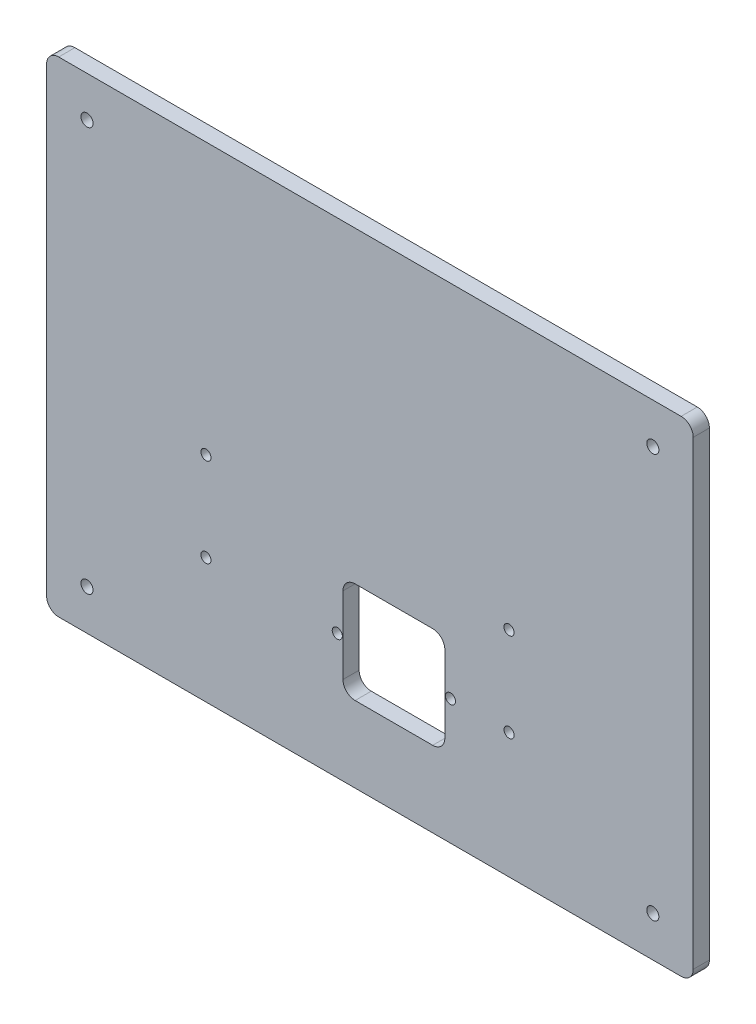
ISO-10303-21;
HEADER;
FILE_DESCRIPTION(('STEP AP214'),'2;1');
FILE_NAME('part.step','',(''),(''),'','','');
FILE_SCHEMA(('AUTOMOTIVE_DESIGN { 1 0 10303 214 1 1 1 1 }'));
ENDSEC;
DATA;
#1=APPLICATION_CONTEXT('core data for automotive mechanical design processes');
#2=APPLICATION_PROTOCOL_DEFINITION('international standard','automotive_design',2000,#1);
#3=PRODUCT_CONTEXT('',#1,'mechanical');
#4=PRODUCT('Part','Part','',(#3));
#5=PRODUCT_RELATED_PRODUCT_CATEGORY('part','',(#4));
#6=PRODUCT_DEFINITION_FORMATION('','',#4);
#7=PRODUCT_DEFINITION_CONTEXT('part definition',#1,'design');
#8=PRODUCT_DEFINITION('design','',#6,#7);
#9=PRODUCT_DEFINITION_SHAPE('','',#8);
#10=(LENGTH_UNIT() NAMED_UNIT(*) SI_UNIT(.MILLI.,.METRE.));
#11=(NAMED_UNIT(*) PLANE_ANGLE_UNIT() SI_UNIT($,.RADIAN.));
#12=(NAMED_UNIT(*) SI_UNIT($,.STERADIAN.) SOLID_ANGLE_UNIT());
#13=UNCERTAINTY_MEASURE_WITH_UNIT(LENGTH_MEASURE(1.E-05),#10,'distance_accuracy_value','');
#14=(GEOMETRIC_REPRESENTATION_CONTEXT(3) GLOBAL_UNCERTAINTY_ASSIGNED_CONTEXT((#13)) GLOBAL_UNIT_ASSIGNED_CONTEXT((#10,
#11,#12)) REPRESENTATION_CONTEXT('',''));
#15=CARTESIAN_POINT('',(0.,0.,0.));
#16=DIRECTION('',(0.,0.,1.));
#17=DIRECTION('',(1.,0.,0.));
#18=AXIS2_PLACEMENT_3D('',#15,#16,#17);
#19=CARTESIAN_POINT('',(-47.5,-60.,4.));
#20=DIRECTION('',(0.,1.,0.));
#21=DIRECTION('',(0.,0.,1.));
#22=AXIS2_PLACEMENT_3D('',#19,#20,#21);
#23=PLANE('',#22);
#24=DIRECTION('',(1.,0.,0.));
#25=VECTOR('',#24,1.);
#26=CARTESIAN_POINT('',(-47.5,-60.,0.));
#27=LINE('',#26,#25);
#28=CARTESIAN_POINT('',(-77.5,-60.,0.));
#29=VERTEX_POINT('',#28);
#30=CARTESIAN_POINT('',(76.5,-60.,0.));
#31=VERTEX_POINT('',#30);
#32=EDGE_CURVE('E240',#29,#31,#27,.T.);
#33=ORIENTED_EDGE('',*,*,#32,.T.);
#34=DIRECTION('',(0.,0.,1.));
#35=VECTOR('',#34,1.);
#36=CARTESIAN_POINT('',(76.5,-60.,4.));
#37=LINE('',#36,#35);
#38=CARTESIAN_POINT('',(76.5,-60.,4.));
#39=VERTEX_POINT('',#38);
#40=EDGE_CURVE('E166',#31,#39,#37,.T.);
#41=ORIENTED_EDGE('',*,*,#40,.T.);
#42=DIRECTION('',(1.,0.,0.));
#43=VECTOR('',#42,1.);
#44=CARTESIAN_POINT('',(-47.5,-60.,4.));
#45=LINE('',#44,#43);
#46=CARTESIAN_POINT('',(-77.5,-60.,4.));
#47=VERTEX_POINT('',#46);
#48=EDGE_CURVE('E246',#47,#39,#45,.T.);
#49=ORIENTED_EDGE('',*,*,#48,.F.);
#50=DIRECTION('',(0.,0.,1.));
#51=VECTOR('',#50,1.);
#52=CARTESIAN_POINT('',(-77.5,-60.,0.));
#53=LINE('',#52,#51);
#54=EDGE_CURVE('E64',#47,#29,#53,.F.);
#55=ORIENTED_EDGE('',*,*,#54,.T.);
#56=EDGE_LOOP('',(#33,#41,#49,#55));
#57=FACE_BOUND('',#56,.T.);
#58=ADVANCED_FACE('F43',(#57),#23,.F.);
#59=CARTESIAN_POINT('',(-47.5,60.,4.));
#60=DIRECTION('',(0.,1.,0.));
#61=DIRECTION('',(0.,0.,1.));
#62=AXIS2_PLACEMENT_3D('',#59,#60,#61);
#63=PLANE('',#62);
#64=DIRECTION('',(1.,0.,0.));
#65=VECTOR('',#64,1.);
#66=CARTESIAN_POINT('',(-47.5,60.,0.));
#67=LINE('',#66,#65);
#68=CARTESIAN_POINT('',(-77.5,60.,0.));
#69=VERTEX_POINT('',#68);
#70=CARTESIAN_POINT('',(76.5,60.,0.));
#71=VERTEX_POINT('',#70);
#72=EDGE_CURVE('E249',#69,#71,#67,.T.);
#73=ORIENTED_EDGE('',*,*,#72,.F.);
#74=DIRECTION('',(0.,0.,1.));
#75=VECTOR('',#74,1.);
#76=CARTESIAN_POINT('',(-77.5,60.,4.));
#77=LINE('',#76,#75);
#78=CARTESIAN_POINT('',(-77.5,60.,4.));
#79=VERTEX_POINT('',#78);
#80=EDGE_CURVE('E275',#69,#79,#77,.T.);
#81=ORIENTED_EDGE('',*,*,#80,.T.);
#82=DIRECTION('',(1.,0.,0.));
#83=VECTOR('',#82,1.);
#84=CARTESIAN_POINT('',(-47.5,60.,4.));
#85=LINE('',#84,#83);
#86=CARTESIAN_POINT('',(76.5,60.,4.));
#87=VERTEX_POINT('',#86);
#88=EDGE_CURVE('E248',#79,#87,#85,.T.);
#89=ORIENTED_EDGE('',*,*,#88,.T.);
#90=DIRECTION('',(0.,0.,1.));
#91=VECTOR('',#90,1.);
#92=CARTESIAN_POINT('',(76.5,60.,4.));
#93=LINE('',#92,#91);
#94=EDGE_CURVE('E269',#87,#71,#93,.F.);
#95=ORIENTED_EDGE('',*,*,#94,.T.);
#96=EDGE_LOOP('',(#73,#81,#89,#95));
#97=FACE_BOUND('',#96,.T.);
#98=ADVANCED_FACE('F358',(#97),#63,.T.);
#99=CARTESIAN_POINT('',(0.,0.,4.));
#100=DIRECTION('',(0.,0.,-1.));
#101=DIRECTION('',(-1.,0.,0.));
#102=AXIS2_PLACEMENT_3D('',#99,#100,#101);
#103=PLANE('',#102);
#104=CARTESIAN_POINT('',(69.5000000000135,-50.0000000000072,4.));
#105=DIRECTION('',(0.,0.,-1.));
#106=DIRECTION('',(-1.,0.,0.));
#107=AXIS2_PLACEMENT_3D('',#104,#105,#106);
#108=CIRCLE('',#107,1.50000000000001);
#109=CARTESIAN_POINT('',(68.0000000000134,-50.0000000000072,4.));
#110=VERTEX_POINT('',#109);
#111=EDGE_CURVE('E446',#110,#110,#108,.T.);
#112=ORIENTED_EDGE('',*,*,#111,.T.);
#113=EDGE_LOOP('',(#112));
#114=FACE_BOUND('',#113,.T.);
#115=CARTESIAN_POINT('',(69.5000000000127,49.9999999999928,4.));
#116=DIRECTION('',(0.,0.,-1.));
#117=DIRECTION('',(-1.,0.,0.));
#118=AXIS2_PLACEMENT_3D('',#115,#116,#117);
#119=CIRCLE('',#118,1.5);
#120=CARTESIAN_POINT('',(68.0000000000127,49.9999999999928,4.));
#121=VERTEX_POINT('',#120);
#122=EDGE_CURVE('E442',#121,#121,#119,.T.);
#123=ORIENTED_EDGE('',*,*,#122,.T.);
#124=EDGE_LOOP('',(#123));
#125=FACE_BOUND('',#124,.T.);
#126=CARTESIAN_POINT('',(-70.4999999999906,49.9999999999917,4.));
#127=DIRECTION('',(0.,0.,-1.));
#128=DIRECTION('',(-1.,0.,0.));
#129=AXIS2_PLACEMENT_3D('',#126,#127,#128);
#130=CIRCLE('',#129,1.5);
#131=CARTESIAN_POINT('',(-71.9999999999906,49.9999999999917,4.));
#132=VERTEX_POINT('',#131);
#133=EDGE_CURVE('E427',#132,#132,#130,.T.);
#134=ORIENTED_EDGE('',*,*,#133,.T.);
#135=EDGE_LOOP('',(#134));
#136=FACE_BOUND('',#135,.T.);
#137=CARTESIAN_POINT('',(-70.4999999999899,-50.0000000000083,4.));
#138=DIRECTION('',(0.,0.,-1.));
#139=DIRECTION('',(-1.,0.,0.));
#140=AXIS2_PLACEMENT_3D('',#137,#138,#139);
#141=CIRCLE('',#140,1.5);
#142=CARTESIAN_POINT('',(-71.9999999999899,-50.0000000000083,4.));
#143=VERTEX_POINT('',#142);
#144=EDGE_CURVE('E316',#143,#143,#141,.T.);
#145=ORIENTED_EDGE('',*,*,#144,.T.);
#146=EDGE_LOOP('',(#145));
#147=FACE_BOUND('',#146,.T.);
#148=DIRECTION('',(0.,-1.,0.));
#149=VECTOR('',#148,1.);
#150=CARTESIAN_POINT('',(18.0333475917252,-16.2240951432028,4.));
#151=LINE('',#150,#149);
#152=CARTESIAN_POINT('',(18.0333475917252,-19.2240951432028,4.));
#153=VERTEX_POINT('',#152);
#154=CARTESIAN_POINT('',(18.0333475917251,-38.2240951432028,4.));
#155=VERTEX_POINT('',#154);
#156=EDGE_CURVE('E180',#153,#155,#151,.T.);
#157=ORIENTED_EDGE('',*,*,#156,.T.);
#158=CARTESIAN_POINT('',(15.0333475917251,-38.2240951432028,4.));
#159=DIRECTION('',(0.,0.,-1.));
#160=DIRECTION('',(-1.,0.,0.));
#161=AXIS2_PLACEMENT_3D('',#158,#159,#160);
#162=CIRCLE('',#161,3.);
#163=CARTESIAN_POINT('',(15.0333475917251,-41.2240951432028,4.));
#164=VERTEX_POINT('',#163);
#165=EDGE_CURVE('E304',#155,#164,#162,.T.);
#166=ORIENTED_EDGE('',*,*,#165,.T.);
#167=DIRECTION('',(-1.,0.,0.));
#168=VECTOR('',#167,1.);
#169=CARTESIAN_POINT('',(-7.16665240827485,-41.2240951432028,4.));
#170=LINE('',#169,#168);
#171=CARTESIAN_POINT('',(-4.16665240827485,-41.2240951432028,4.));
#172=VERTEX_POINT('',#171);
#173=EDGE_CURVE('E203',#164,#172,#170,.T.);
#174=ORIENTED_EDGE('',*,*,#173,.T.);
#175=CARTESIAN_POINT('',(-4.16665240827485,-38.2240951432028,4.));
#176=DIRECTION('',(0.,0.,-1.));
#177=DIRECTION('',(-1.,0.,0.));
#178=AXIS2_PLACEMENT_3D('',#175,#176,#177);
#179=CIRCLE('',#178,3.);
#180=CARTESIAN_POINT('',(-7.16665240827485,-38.2240951432028,4.));
#181=VERTEX_POINT('',#180);
#182=EDGE_CURVE('E307',#172,#181,#179,.T.);
#183=ORIENTED_EDGE('',*,*,#182,.T.);
#184=DIRECTION('',(0.,1.,0.));
#185=VECTOR('',#184,1.);
#186=CARTESIAN_POINT('',(-7.16665240827485,-16.2240951432028,4.));
#187=LINE('',#186,#185);
#188=CARTESIAN_POINT('',(-7.16665240827485,-19.2240951432028,4.));
#189=VERTEX_POINT('',#188);
#190=EDGE_CURVE('E188',#181,#189,#187,.T.);
#191=ORIENTED_EDGE('',*,*,#190,.T.);
#192=CARTESIAN_POINT('',(-4.16665240827485,-19.2240951432028,4.));
#193=DIRECTION('',(0.,0.,-1.));
#194=DIRECTION('',(-1.,0.,0.));
#195=AXIS2_PLACEMENT_3D('',#192,#193,#194);
#196=CIRCLE('',#195,3.);
#197=CARTESIAN_POINT('',(-4.16665240827485,-16.2240951432028,4.));
#198=VERTEX_POINT('',#197);
#199=EDGE_CURVE('E11',#189,#198,#196,.T.);
#200=ORIENTED_EDGE('',*,*,#199,.T.);
#201=DIRECTION('',(1.,0.,0.));
#202=VECTOR('',#201,1.);
#203=CARTESIAN_POINT('',(-7.16665240827485,-16.2240951432028,4.));
#204=LINE('',#203,#202);
#205=CARTESIAN_POINT('',(15.0333475917252,-16.2240951432028,4.));
#206=VERTEX_POINT('',#205);
#207=EDGE_CURVE('E327',#198,#206,#204,.T.);
#208=ORIENTED_EDGE('',*,*,#207,.T.);
#209=CARTESIAN_POINT('',(15.0333475917252,-19.2240951432028,4.));
#210=DIRECTION('',(0.,0.,-1.));
#211=DIRECTION('',(-1.,0.,0.));
#212=AXIS2_PLACEMENT_3D('',#209,#210,#211);
#213=CIRCLE('',#212,3.);
#214=EDGE_CURVE('E170',#206,#153,#213,.T.);
#215=ORIENTED_EDGE('',*,*,#214,.T.);
#216=EDGE_LOOP('',(#157,#166,#174,#183,#191,#200,#208,#215));
#217=FACE_BOUND('',#216,.T.);
#218=CARTESIAN_POINT('',(33.9254697723463,-29.0234263182221,4.));
#219=DIRECTION('',(0.,0.,1.));
#220=DIRECTION('',(1.,0.,0.));
#221=AXIS2_PLACEMENT_3D('',#218,#219,#220);
#222=CIRCLE('',#221,1.25);
#223=CARTESIAN_POINT('',(35.1754697723463,-29.0234263182221,4.));
#224=VERTEX_POINT('',#223);
#225=EDGE_CURVE('E211',#224,#224,#222,.T.);
#226=ORIENTED_EDGE('',*,*,#225,.F.);
#227=EDGE_LOOP('',(#226));
#228=FACE_BOUND('',#227,.T.);
#229=CARTESIAN_POINT('',(-41.0745302242441,-29.0234263182226,4.));
#230=DIRECTION('',(0.,0.,1.));
#231=DIRECTION('',(1.,0.,0.));
#232=AXIS2_PLACEMENT_3D('',#229,#230,#231);
#233=CIRCLE('',#232,1.25);
#234=CARTESIAN_POINT('',(-39.8245302242441,-29.0234263182226,4.));
#235=VERTEX_POINT('',#234);
#236=EDGE_CURVE('E202',#235,#235,#233,.T.);
#237=ORIENTED_EDGE('',*,*,#236,.F.);
#238=EDGE_LOOP('',(#237));
#239=FACE_BOUND('',#238,.T.);
#240=CARTESIAN_POINT('',(-41.0745302242442,-7.02342649884435,4.));
#241=DIRECTION('',(0.,0.,1.));
#242=DIRECTION('',(1.,0.,0.));
#243=AXIS2_PLACEMENT_3D('',#240,#241,#242);
#244=CIRCLE('',#243,1.25);
#245=CARTESIAN_POINT('',(-39.8245302242442,-7.02342649884435,4.));
#246=VERTEX_POINT('',#245);
#247=EDGE_CURVE('E223',#246,#246,#244,.T.);
#248=ORIENTED_EDGE('',*,*,#247,.F.);
#249=EDGE_LOOP('',(#248));
#250=FACE_BOUND('',#249,.T.);
#251=CARTESIAN_POINT('',(-8.5745336312968,-29.0234263182224,4.));
#252=DIRECTION('',(0.,0.,1.));
#253=DIRECTION('',(1.,0.,0.));
#254=AXIS2_PLACEMENT_3D('',#251,#252,#253);
#255=CIRCLE('',#254,1.25083438924972);
#256=CARTESIAN_POINT('',(-7.32369924204708,-29.0234263182224,4.));
#257=VERTEX_POINT('',#256);
#258=EDGE_CURVE('E216',#257,#257,#255,.T.);
#259=ORIENTED_EDGE('',*,*,#258,.F.);
#260=EDGE_LOOP('',(#259));
#261=FACE_BOUND('',#260,.T.);
#262=CARTESIAN_POINT('',(33.9254697723315,-7.02342649884379,4.));
#263=DIRECTION('',(0.,0.,1.));
#264=DIRECTION('',(1.,0.,0.));
#265=AXIS2_PLACEMENT_3D('',#262,#263,#264);
#266=CIRCLE('',#265,1.24999999999896);
#267=CARTESIAN_POINT('',(35.1754697723305,-7.02342649884379,4.));
#268=VERTEX_POINT('',#267);
#269=EDGE_CURVE('E196',#268,#268,#266,.T.);
#270=ORIENTED_EDGE('',*,*,#269,.F.);
#271=EDGE_LOOP('',(#270));
#272=FACE_BOUND('',#271,.T.);
#273=CARTESIAN_POINT('',(19.4254663687032,-29.0234263182222,4.));
#274=DIRECTION('',(0.,0.,1.));
#275=DIRECTION('',(1.,0.,0.));
#276=AXIS2_PLACEMENT_3D('',#273,#274,#275);
#277=CIRCLE('',#276,1.25);
#278=CARTESIAN_POINT('',(20.6754663687032,-29.0234263182222,4.));
#279=VERTEX_POINT('',#278);
#280=EDGE_CURVE('E218',#279,#279,#277,.T.);
#281=ORIENTED_EDGE('',*,*,#280,.F.);
#282=EDGE_LOOP('',(#281));
#283=FACE_BOUND('',#282,.T.);
#284=ORIENTED_EDGE('',*,*,#88,.F.);
#285=CARTESIAN_POINT('',(-77.5,57.,4.));
#286=DIRECTION('',(0.,0.,-1.));
#287=DIRECTION('',(-1.,0.,0.));
#288=AXIS2_PLACEMENT_3D('',#285,#286,#287);
#289=CIRCLE('',#288,3.);
#290=CARTESIAN_POINT('',(-80.5,57.,4.));
#291=VERTEX_POINT('',#290);
#292=EDGE_CURVE('E281',#79,#291,#289,.F.);
#293=ORIENTED_EDGE('',*,*,#292,.T.);
#294=DIRECTION('',(0.,-1.,0.));
#295=VECTOR('',#294,1.);
#296=CARTESIAN_POINT('',(-80.5,60.,4.));
#297=LINE('',#296,#295);
#298=CARTESIAN_POINT('',(-80.5,-57.,4.));
#299=VERTEX_POINT('',#298);
#300=EDGE_CURVE('E238',#291,#299,#297,.T.);
#301=ORIENTED_EDGE('',*,*,#300,.T.);
#302=CARTESIAN_POINT('',(-77.5,-57.,4.));
#303=DIRECTION('',(0.,0.,-1.));
#304=DIRECTION('',(-1.,0.,0.));
#305=AXIS2_PLACEMENT_3D('',#302,#303,#304);
#306=CIRCLE('',#305,3.);
#307=EDGE_CURVE('E273',#299,#47,#306,.F.);
#308=ORIENTED_EDGE('',*,*,#307,.T.);
#309=ORIENTED_EDGE('',*,*,#48,.T.);
#310=CARTESIAN_POINT('',(76.5,-57.,4.));
#311=DIRECTION('',(0.,0.,-1.));
#312=DIRECTION('',(-1.,0.,0.));
#313=AXIS2_PLACEMENT_3D('',#310,#311,#312);
#314=CIRCLE('',#313,3.);
#315=CARTESIAN_POINT('',(79.5,-57.,4.));
#316=VERTEX_POINT('',#315);
#317=EDGE_CURVE('E280',#39,#316,#314,.F.);
#318=ORIENTED_EDGE('',*,*,#317,.T.);
#319=DIRECTION('',(0.,1.,0.));
#320=VECTOR('',#319,1.);
#321=CARTESIAN_POINT('',(79.5,60.,4.));
#322=LINE('',#321,#320);
#323=CARTESIAN_POINT('',(79.5,57.,4.));
#324=VERTEX_POINT('',#323);
#325=EDGE_CURVE('E234',#316,#324,#322,.T.);
#326=ORIENTED_EDGE('',*,*,#325,.T.);
#327=CARTESIAN_POINT('',(76.5,57.,4.));
#328=DIRECTION('',(0.,0.,-1.));
#329=DIRECTION('',(-1.,0.,0.));
#330=AXIS2_PLACEMENT_3D('',#327,#328,#329);
#331=CIRCLE('',#330,3.);
#332=EDGE_CURVE('E278',#324,#87,#331,.F.);
#333=ORIENTED_EDGE('',*,*,#332,.T.);
#334=EDGE_LOOP('',(#284,#293,#301,#308,#309,#318,#326,#333));
#335=FACE_BOUND('',#334,.T.);
#336=ADVANCED_FACE('F324',(#114,#125,#136,#147,#217,#228,#239,#250,#261,#272,#283,#335),#103,.F.);
#337=CARTESIAN_POINT('',(0.,0.,0.));
#338=DIRECTION('',(0.,0.,-1.));
#339=DIRECTION('',(-1.,0.,0.));
#340=AXIS2_PLACEMENT_3D('',#337,#338,#339);
#341=PLANE('',#340);
#342=CARTESIAN_POINT('',(69.5000000000135,-50.0000000000072,0.));
#343=DIRECTION('',(0.,0.,-1.));
#344=DIRECTION('',(-1.,0.,0.));
#345=AXIS2_PLACEMENT_3D('',#342,#343,#344);
#346=CIRCLE('',#345,1.50000000000001);
#347=CARTESIAN_POINT('',(68.0000000000134,-50.0000000000072,0.));
#348=VERTEX_POINT('',#347);
#349=EDGE_CURVE('E447',#348,#348,#346,.T.);
#350=ORIENTED_EDGE('',*,*,#349,.F.);
#351=EDGE_LOOP('',(#350));
#352=FACE_BOUND('',#351,.T.);
#353=CARTESIAN_POINT('',(69.5000000000127,49.9999999999928,0.));
#354=DIRECTION('',(0.,0.,-1.));
#355=DIRECTION('',(-1.,0.,0.));
#356=AXIS2_PLACEMENT_3D('',#353,#354,#355);
#357=CIRCLE('',#356,1.5);
#358=CARTESIAN_POINT('',(68.0000000000127,49.9999999999928,0.));
#359=VERTEX_POINT('',#358);
#360=EDGE_CURVE('E438',#359,#359,#357,.T.);
#361=ORIENTED_EDGE('',*,*,#360,.F.);
#362=EDGE_LOOP('',(#361));
#363=FACE_BOUND('',#362,.T.);
#364=CARTESIAN_POINT('',(-70.4999999999906,49.9999999999917,0.));
#365=DIRECTION('',(0.,0.,-1.));
#366=DIRECTION('',(-1.,0.,0.));
#367=AXIS2_PLACEMENT_3D('',#364,#365,#366);
#368=CIRCLE('',#367,1.5);
#369=CARTESIAN_POINT('',(-71.9999999999906,49.9999999999917,0.));
#370=VERTEX_POINT('',#369);
#371=EDGE_CURVE('E433',#370,#370,#368,.T.);
#372=ORIENTED_EDGE('',*,*,#371,.F.);
#373=EDGE_LOOP('',(#372));
#374=FACE_BOUND('',#373,.T.);
#375=CARTESIAN_POINT('',(-70.4999999999899,-50.0000000000083,0.));
#376=DIRECTION('',(0.,0.,-1.));
#377=DIRECTION('',(-1.,0.,0.));
#378=AXIS2_PLACEMENT_3D('',#375,#376,#377);
#379=CIRCLE('',#378,1.5);
#380=CARTESIAN_POINT('',(-71.9999999999899,-50.0000000000083,0.));
#381=VERTEX_POINT('',#380);
#382=EDGE_CURVE('E434',#381,#381,#379,.T.);
#383=ORIENTED_EDGE('',*,*,#382,.F.);
#384=EDGE_LOOP('',(#383));
#385=FACE_BOUND('',#384,.T.);
#386=DIRECTION('',(0.,1.,0.));
#387=VECTOR('',#386,1.);
#388=CARTESIAN_POINT('',(-7.16665240827485,-16.2240951432028,0.));
#389=LINE('',#388,#387);
#390=CARTESIAN_POINT('',(-7.16665240827485,-38.2240951432028,0.));
#391=VERTEX_POINT('',#390);
#392=CARTESIAN_POINT('',(-7.16665240827485,-19.2240951432028,0.));
#393=VERTEX_POINT('',#392);
#394=EDGE_CURVE('E195',#391,#393,#389,.T.);
#395=ORIENTED_EDGE('',*,*,#394,.F.);
#396=CARTESIAN_POINT('',(-4.16665240827485,-38.2240951432028,0.));
#397=DIRECTION('',(0.,0.,-1.));
#398=DIRECTION('',(-1.,0.,0.));
#399=AXIS2_PLACEMENT_3D('',#396,#397,#398);
#400=CIRCLE('',#399,3.);
#401=CARTESIAN_POINT('',(-4.16665240827485,-41.2240951432028,0.));
#402=VERTEX_POINT('',#401);
#403=EDGE_CURVE('E310',#391,#402,#400,.F.);
#404=ORIENTED_EDGE('',*,*,#403,.T.);
#405=DIRECTION('',(-1.,0.,0.));
#406=VECTOR('',#405,1.);
#407=CARTESIAN_POINT('',(-7.16665240827485,-41.2240951432028,0.));
#408=LINE('',#407,#406);
#409=CARTESIAN_POINT('',(15.0333475917251,-41.2240951432028,0.));
#410=VERTEX_POINT('',#409);
#411=EDGE_CURVE('E187',#410,#402,#408,.T.);
#412=ORIENTED_EDGE('',*,*,#411,.F.);
#413=CARTESIAN_POINT('',(15.0333475917251,-38.2240951432028,0.));
#414=DIRECTION('',(0.,0.,-1.));
#415=DIRECTION('',(-1.,0.,0.));
#416=AXIS2_PLACEMENT_3D('',#413,#414,#415);
#417=CIRCLE('',#416,3.);
#418=CARTESIAN_POINT('',(18.0333475917251,-38.2240951432028,0.));
#419=VERTEX_POINT('',#418);
#420=EDGE_CURVE('E184',#410,#419,#417,.F.);
#421=ORIENTED_EDGE('',*,*,#420,.T.);
#422=DIRECTION('',(0.,-1.,0.));
#423=VECTOR('',#422,1.);
#424=CARTESIAN_POINT('',(18.0333475917252,-16.2240951432028,0.));
#425=LINE('',#424,#423);
#426=CARTESIAN_POINT('',(18.0333475917252,-19.2240951432028,0.));
#427=VERTEX_POINT('',#426);
#428=EDGE_CURVE('E172',#427,#419,#425,.T.);
#429=ORIENTED_EDGE('',*,*,#428,.F.);
#430=CARTESIAN_POINT('',(15.0333475917252,-19.2240951432028,0.));
#431=DIRECTION('',(0.,0.,-1.));
#432=DIRECTION('',(-1.,0.,0.));
#433=AXIS2_PLACEMENT_3D('',#430,#431,#432);
#434=CIRCLE('',#433,3.);
#435=CARTESIAN_POINT('',(15.0333475917252,-16.2240951432028,0.));
#436=VERTEX_POINT('',#435);
#437=EDGE_CURVE('E160',#427,#436,#434,.F.);
#438=ORIENTED_EDGE('',*,*,#437,.T.);
#439=DIRECTION('',(1.,0.,0.));
#440=VECTOR('',#439,1.);
#441=CARTESIAN_POINT('',(-7.16665240827485,-16.2240951432028,0.));
#442=LINE('',#441,#440);
#443=CARTESIAN_POINT('',(-4.16665240827485,-16.2240951432028,0.));
#444=VERTEX_POINT('',#443);
#445=EDGE_CURVE('E190',#444,#436,#442,.T.);
#446=ORIENTED_EDGE('',*,*,#445,.F.);
#447=CARTESIAN_POINT('',(-4.16665240827485,-19.2240951432028,0.));
#448=DIRECTION('',(0.,0.,-1.));
#449=DIRECTION('',(-1.,0.,0.));
#450=AXIS2_PLACEMENT_3D('',#447,#448,#449);
#451=CIRCLE('',#450,3.);
#452=EDGE_CURVE('E51',#444,#393,#451,.F.);
#453=ORIENTED_EDGE('',*,*,#452,.T.);
#454=EDGE_LOOP('',(#395,#404,#412,#421,#429,#438,#446,#453));
#455=FACE_BOUND('',#454,.T.);
#456=CARTESIAN_POINT('',(33.9254697723463,-29.0234263182221,0.));
#457=DIRECTION('',(0.,0.,1.));
#458=DIRECTION('',(1.,0.,0.));
#459=AXIS2_PLACEMENT_3D('',#456,#457,#458);
#460=CIRCLE('',#459,1.25);
#461=CARTESIAN_POINT('',(35.1754697723463,-29.0234263182221,0.));
#462=VERTEX_POINT('',#461);
#463=EDGE_CURVE('E198',#462,#462,#460,.T.);
#464=ORIENTED_EDGE('',*,*,#463,.T.);
#465=EDGE_LOOP('',(#464));
#466=FACE_BOUND('',#465,.T.);
#467=CARTESIAN_POINT('',(-41.0745302242441,-29.0234263182226,0.));
#468=DIRECTION('',(0.,0.,1.));
#469=DIRECTION('',(1.,0.,0.));
#470=AXIS2_PLACEMENT_3D('',#467,#468,#469);
#471=CIRCLE('',#470,1.25);
#472=CARTESIAN_POINT('',(-39.8245302242441,-29.0234263182226,0.));
#473=VERTEX_POINT('',#472);
#474=EDGE_CURVE('E206',#473,#473,#471,.T.);
#475=ORIENTED_EDGE('',*,*,#474,.T.);
#476=EDGE_LOOP('',(#475));
#477=FACE_BOUND('',#476,.T.);
#478=CARTESIAN_POINT('',(-41.0745302242442,-7.02342649884435,0.));
#479=DIRECTION('',(0.,0.,1.));
#480=DIRECTION('',(1.,0.,0.));
#481=AXIS2_PLACEMENT_3D('',#478,#479,#480);
#482=CIRCLE('',#481,1.25);
#483=CARTESIAN_POINT('',(-39.8245302242442,-7.02342649884435,0.));
#484=VERTEX_POINT('',#483);
#485=EDGE_CURVE('E210',#484,#484,#482,.T.);
#486=ORIENTED_EDGE('',*,*,#485,.T.);
#487=EDGE_LOOP('',(#486));
#488=FACE_BOUND('',#487,.T.);
#489=CARTESIAN_POINT('',(-8.5745336312968,-29.0234263182224,0.));
#490=DIRECTION('',(0.,0.,1.));
#491=DIRECTION('',(1.,0.,0.));
#492=AXIS2_PLACEMENT_3D('',#489,#490,#491);
#493=CIRCLE('',#492,1.25083438924972);
#494=CARTESIAN_POINT('',(-7.32369924204708,-29.0234263182224,0.));
#495=VERTEX_POINT('',#494);
#496=EDGE_CURVE('E220',#495,#495,#493,.T.);
#497=ORIENTED_EDGE('',*,*,#496,.T.);
#498=EDGE_LOOP('',(#497));
#499=FACE_BOUND('',#498,.T.);
#500=CARTESIAN_POINT('',(33.9254697723315,-7.02342649884379,0.));
#501=DIRECTION('',(0.,0.,1.));
#502=DIRECTION('',(1.,0.,0.));
#503=AXIS2_PLACEMENT_3D('',#500,#501,#502);
#504=CIRCLE('',#503,1.24999999999896);
#505=CARTESIAN_POINT('',(35.1754697723305,-7.02342649884379,0.));
#506=VERTEX_POINT('',#505);
#507=EDGE_CURVE('E200',#506,#506,#504,.T.);
#508=ORIENTED_EDGE('',*,*,#507,.T.);
#509=EDGE_LOOP('',(#508));
#510=FACE_BOUND('',#509,.T.);
#511=CARTESIAN_POINT('',(19.4254663687032,-29.0234263182222,0.));
#512=DIRECTION('',(0.,0.,1.));
#513=DIRECTION('',(1.,0.,0.));
#514=AXIS2_PLACEMENT_3D('',#511,#512,#513);
#515=CIRCLE('',#514,1.25);
#516=CARTESIAN_POINT('',(20.6754663687032,-29.0234263182222,0.));
#517=VERTEX_POINT('',#516);
#518=EDGE_CURVE('E226',#517,#517,#515,.T.);
#519=ORIENTED_EDGE('',*,*,#518,.T.);
#520=EDGE_LOOP('',(#519));
#521=FACE_BOUND('',#520,.T.);
#522=DIRECTION('',(0.,-1.,0.));
#523=VECTOR('',#522,1.);
#524=CARTESIAN_POINT('',(-80.5,60.,0.));
#525=LINE('',#524,#523);
#526=CARTESIAN_POINT('',(-80.5,57.,0.));
#527=VERTEX_POINT('',#526);
#528=CARTESIAN_POINT('',(-80.5,-57.,0.));
#529=VERTEX_POINT('',#528);
#530=EDGE_CURVE('E233',#527,#529,#525,.T.);
#531=ORIENTED_EDGE('',*,*,#530,.F.);
#532=CARTESIAN_POINT('',(-77.5,57.,0.));
#533=DIRECTION('',(0.,0.,-1.));
#534=DIRECTION('',(-1.,0.,0.));
#535=AXIS2_PLACEMENT_3D('',#532,#533,#534);
#536=CIRCLE('',#535,3.);
#537=EDGE_CURVE('E291',#527,#69,#536,.T.);
#538=ORIENTED_EDGE('',*,*,#537,.T.);
#539=ORIENTED_EDGE('',*,*,#72,.T.);
#540=CARTESIAN_POINT('',(76.5,57.,0.));
#541=DIRECTION('',(0.,0.,-1.));
#542=DIRECTION('',(-1.,0.,0.));
#543=AXIS2_PLACEMENT_3D('',#540,#541,#542);
#544=CIRCLE('',#543,3.);
#545=CARTESIAN_POINT('',(79.5,57.,0.));
#546=VERTEX_POINT('',#545);
#547=EDGE_CURVE('E293',#71,#546,#544,.T.);
#548=ORIENTED_EDGE('',*,*,#547,.T.);
#549=DIRECTION('',(0.,1.,0.));
#550=VECTOR('',#549,1.);
#551=CARTESIAN_POINT('',(79.5,60.,0.));
#552=LINE('',#551,#550);
#553=CARTESIAN_POINT('',(79.5,-57.,0.));
#554=VERTEX_POINT('',#553);
#555=EDGE_CURVE('E241',#554,#546,#552,.T.);
#556=ORIENTED_EDGE('',*,*,#555,.F.);
#557=CARTESIAN_POINT('',(76.5,-57.,0.));
#558=DIRECTION('',(0.,0.,-1.));
#559=DIRECTION('',(-1.,0.,0.));
#560=AXIS2_PLACEMENT_3D('',#557,#558,#559);
#561=CIRCLE('',#560,3.);
#562=EDGE_CURVE('E59',#554,#31,#561,.T.);
#563=ORIENTED_EDGE('',*,*,#562,.T.);
#564=ORIENTED_EDGE('',*,*,#32,.F.);
#565=CARTESIAN_POINT('',(-77.5,-57.,0.));
#566=DIRECTION('',(0.,0.,-1.));
#567=DIRECTION('',(-1.,0.,0.));
#568=AXIS2_PLACEMENT_3D('',#565,#566,#567);
#569=CIRCLE('',#568,3.);
#570=EDGE_CURVE('E288',#29,#529,#569,.T.);
#571=ORIENTED_EDGE('',*,*,#570,.T.);
#572=EDGE_LOOP('',(#531,#538,#539,#548,#556,#563,#564,#571));
#573=FACE_BOUND('',#572,.T.);
#574=ADVANCED_FACE('F185',(#352,#363,#374,#385,#455,#466,#477,#488,#499,#510,#521,#573),#341,.T.);
#575=CARTESIAN_POINT('',(-80.5,60.,-200.));
#576=DIRECTION('',(-1.,0.,0.));
#577=DIRECTION('',(0.,-1.,0.));
#578=AXIS2_PLACEMENT_3D('',#575,#576,#577);
#579=PLANE('',#578);
#580=ORIENTED_EDGE('',*,*,#300,.F.);
#581=DIRECTION('',(0.,0.,1.));
#582=VECTOR('',#581,1.);
#583=CARTESIAN_POINT('',(-80.5,57.,-200.));
#584=LINE('',#583,#582);
#585=EDGE_CURVE('E286',#291,#527,#584,.F.);
#586=ORIENTED_EDGE('',*,*,#585,.T.);
#587=ORIENTED_EDGE('',*,*,#530,.T.);
#588=DIRECTION('',(0.,0.,1.));
#589=VECTOR('',#588,1.);
#590=CARTESIAN_POINT('',(-80.5,-57.,4.));
#591=LINE('',#590,#589);
#592=EDGE_CURVE('E284',#529,#299,#591,.T.);
#593=ORIENTED_EDGE('',*,*,#592,.T.);
#594=EDGE_LOOP('',(#580,#586,#587,#593));
#595=FACE_BOUND('',#594,.T.);
#596=ADVANCED_FACE('F370',(#595),#579,.T.);
#597=CARTESIAN_POINT('',(79.5,60.,-200.));
#598=DIRECTION('',(1.,0.,0.));
#599=DIRECTION('',(0.,1.,0.));
#600=AXIS2_PLACEMENT_3D('',#597,#598,#599);
#601=PLANE('',#600);
#602=ORIENTED_EDGE('',*,*,#555,.T.);
#603=DIRECTION('',(0.,0.,1.));
#604=VECTOR('',#603,1.);
#605=CARTESIAN_POINT('',(79.5,57.,-200.));
#606=LINE('',#605,#604);
#607=EDGE_CURVE('E300',#546,#324,#606,.T.);
#608=ORIENTED_EDGE('',*,*,#607,.T.);
#609=ORIENTED_EDGE('',*,*,#325,.F.);
#610=DIRECTION('',(0.,0.,1.));
#611=VECTOR('',#610,1.);
#612=CARTESIAN_POINT('',(79.5,-57.,0.));
#613=LINE('',#612,#611);
#614=EDGE_CURVE('E294',#316,#554,#613,.F.);
#615=ORIENTED_EDGE('',*,*,#614,.T.);
#616=EDGE_LOOP('',(#602,#608,#609,#615));
#617=FACE_BOUND('',#616,.T.);
#618=ADVANCED_FACE('F372',(#617),#601,.T.);
#619=CARTESIAN_POINT('',(19.4254663687032,-29.0234263182222,0.));
#620=DIRECTION('',(0.,0.,1.));
#621=DIRECTION('',(1.,0.,0.));
#622=AXIS2_PLACEMENT_3D('',#619,#620,#621);
#623=CYLINDRICAL_SURFACE('',#622,1.25);
#624=ORIENTED_EDGE('',*,*,#518,.F.);
#625=EDGE_LOOP('',(#624));
#626=FACE_BOUND('',#625,.T.);
#627=ORIENTED_EDGE('',*,*,#280,.T.);
#628=EDGE_LOOP('',(#627));
#629=FACE_BOUND('',#628,.T.);
#630=ADVANCED_FACE('F377',(#626,#629),#623,.F.);
#631=CARTESIAN_POINT('',(33.9254697723315,-7.02342649884379,0.));
#632=DIRECTION('',(0.,0.,1.));
#633=DIRECTION('',(1.,0.,0.));
#634=AXIS2_PLACEMENT_3D('',#631,#632,#633);
#635=CYLINDRICAL_SURFACE('',#634,1.24999999999896);
#636=ORIENTED_EDGE('',*,*,#507,.F.);
#637=EDGE_LOOP('',(#636));
#638=FACE_BOUND('',#637,.T.);
#639=ORIENTED_EDGE('',*,*,#269,.T.);
#640=EDGE_LOOP('',(#639));
#641=FACE_BOUND('',#640,.T.);
#642=ADVANCED_FACE('F385',(#638,#641),#635,.F.);
#643=CARTESIAN_POINT('',(-8.5745336312968,-29.0234263182224,0.));
#644=DIRECTION('',(0.,0.,1.));
#645=DIRECTION('',(1.,0.,0.));
#646=AXIS2_PLACEMENT_3D('',#643,#644,#645);
#647=CYLINDRICAL_SURFACE('',#646,1.25083438924972);
#648=ORIENTED_EDGE('',*,*,#496,.F.);
#649=EDGE_LOOP('',(#648));
#650=FACE_BOUND('',#649,.T.);
#651=ORIENTED_EDGE('',*,*,#258,.T.);
#652=EDGE_LOOP('',(#651));
#653=FACE_BOUND('',#652,.T.);
#654=ADVANCED_FACE('F387',(#650,#653),#647,.F.);
#655=CARTESIAN_POINT('',(-41.0745302242442,-7.02342649884435,0.));
#656=DIRECTION('',(0.,0.,1.));
#657=DIRECTION('',(1.,0.,0.));
#658=AXIS2_PLACEMENT_3D('',#655,#656,#657);
#659=CYLINDRICAL_SURFACE('',#658,1.25);
#660=ORIENTED_EDGE('',*,*,#485,.F.);
#661=EDGE_LOOP('',(#660));
#662=FACE_BOUND('',#661,.T.);
#663=ORIENTED_EDGE('',*,*,#247,.T.);
#664=EDGE_LOOP('',(#663));
#665=FACE_BOUND('',#664,.T.);
#666=ADVANCED_FACE('F381',(#662,#665),#659,.F.);
#667=CARTESIAN_POINT('',(-41.0745302242441,-29.0234263182226,0.));
#668=DIRECTION('',(0.,0.,1.));
#669=DIRECTION('',(1.,0.,0.));
#670=AXIS2_PLACEMENT_3D('',#667,#668,#669);
#671=CYLINDRICAL_SURFACE('',#670,1.25);
#672=ORIENTED_EDGE('',*,*,#474,.F.);
#673=EDGE_LOOP('',(#672));
#674=FACE_BOUND('',#673,.T.);
#675=ORIENTED_EDGE('',*,*,#236,.T.);
#676=EDGE_LOOP('',(#675));
#677=FACE_BOUND('',#676,.T.);
#678=ADVANCED_FACE('F390',(#674,#677),#671,.F.);
#679=CARTESIAN_POINT('',(33.9254697723463,-29.0234263182221,0.));
#680=DIRECTION('',(0.,0.,1.));
#681=DIRECTION('',(1.,0.,0.));
#682=AXIS2_PLACEMENT_3D('',#679,#680,#681);
#683=CYLINDRICAL_SURFACE('',#682,1.25);
#684=ORIENTED_EDGE('',*,*,#463,.F.);
#685=EDGE_LOOP('',(#684));
#686=FACE_BOUND('',#685,.T.);
#687=ORIENTED_EDGE('',*,*,#225,.T.);
#688=EDGE_LOOP('',(#687));
#689=FACE_BOUND('',#688,.T.);
#690=ADVANCED_FACE('F394',(#686,#689),#683,.F.);
#691=CARTESIAN_POINT('',(-7.16665240827485,-16.2240951432028,4.));
#692=DIRECTION('',(-1.,0.,0.));
#693=DIRECTION('',(0.,-1.,0.));
#694=AXIS2_PLACEMENT_3D('',#691,#692,#693);
#695=PLANE('',#694);
#696=ORIENTED_EDGE('',*,*,#190,.F.);
#697=DIRECTION('',(0.,0.,-1.));
#698=VECTOR('',#697,1.);
#699=CARTESIAN_POINT('',(-7.16665240827485,-38.2240951432028,0.));
#700=LINE('',#699,#698);
#701=EDGE_CURVE('E270',#181,#391,#700,.T.);
#702=ORIENTED_EDGE('',*,*,#701,.T.);
#703=ORIENTED_EDGE('',*,*,#394,.T.);
#704=DIRECTION('',(0.,0.,-1.));
#705=VECTOR('',#704,1.);
#706=CARTESIAN_POINT('',(-7.16665240827485,-19.2240951432028,4.));
#707=LINE('',#706,#705);
#708=EDGE_CURVE('E265',#393,#189,#707,.F.);
#709=ORIENTED_EDGE('',*,*,#708,.T.);
#710=EDGE_LOOP('',(#696,#702,#703,#709));
#711=FACE_BOUND('',#710,.T.);
#712=ADVANCED_FACE('F317',(#711),#695,.F.);
#713=CARTESIAN_POINT('',(-7.16665240827485,-41.2240951432028,4.));
#714=DIRECTION('',(0.,-1.,0.));
#715=DIRECTION('',(0.,0.,-1.));
#716=AXIS2_PLACEMENT_3D('',#713,#714,#715);
#717=PLANE('',#716);
#718=ORIENTED_EDGE('',*,*,#173,.F.);
#719=DIRECTION('',(0.,0.,-1.));
#720=VECTOR('',#719,1.);
#721=CARTESIAN_POINT('',(15.0333475917251,-41.2240951432028,0.));
#722=LINE('',#721,#720);
#723=EDGE_CURVE('E262',#164,#410,#722,.T.);
#724=ORIENTED_EDGE('',*,*,#723,.T.);
#725=ORIENTED_EDGE('',*,*,#411,.T.);
#726=DIRECTION('',(0.,0.,-1.));
#727=VECTOR('',#726,1.);
#728=CARTESIAN_POINT('',(-4.16665240827485,-41.2240951432028,4.));
#729=LINE('',#728,#727);
#730=EDGE_CURVE('E259',#402,#172,#729,.F.);
#731=ORIENTED_EDGE('',*,*,#730,.T.);
#732=EDGE_LOOP('',(#718,#724,#725,#731));
#733=FACE_BOUND('',#732,.T.);
#734=ADVANCED_FACE('F343',(#733),#717,.F.);
#735=CARTESIAN_POINT('',(18.0333475917252,-16.2240951432028,4.));
#736=DIRECTION('',(1.,0.,0.));
#737=DIRECTION('',(0.,1.,0.));
#738=AXIS2_PLACEMENT_3D('',#735,#736,#737);
#739=PLANE('',#738);
#740=ORIENTED_EDGE('',*,*,#156,.F.);
#741=DIRECTION('',(0.,0.,-1.));
#742=VECTOR('',#741,1.);
#743=CARTESIAN_POINT('',(18.0333475917252,-19.2240951432028,0.));
#744=LINE('',#743,#742);
#745=EDGE_CURVE('E163',#153,#427,#744,.T.);
#746=ORIENTED_EDGE('',*,*,#745,.T.);
#747=ORIENTED_EDGE('',*,*,#428,.T.);
#748=DIRECTION('',(0.,0.,-1.));
#749=VECTOR('',#748,1.);
#750=CARTESIAN_POINT('',(18.0333475917251,-38.2240951432028,4.));
#751=LINE('',#750,#749);
#752=EDGE_CURVE('E177',#419,#155,#751,.F.);
#753=ORIENTED_EDGE('',*,*,#752,.T.);
#754=EDGE_LOOP('',(#740,#746,#747,#753));
#755=FACE_BOUND('',#754,.T.);
#756=ADVANCED_FACE('F173',(#755),#739,.F.);
#757=CARTESIAN_POINT('',(-7.16665240827485,-16.2240951432028,4.));
#758=DIRECTION('',(0.,1.,0.));
#759=DIRECTION('',(-1.,0.,0.));
#760=AXIS2_PLACEMENT_3D('',#757,#758,#759);
#761=PLANE('',#760);
#762=ORIENTED_EDGE('',*,*,#445,.T.);
#763=DIRECTION('',(0.,0.,-1.));
#764=VECTOR('',#763,1.);
#765=CARTESIAN_POINT('',(15.0333475917252,-16.2240951432028,4.));
#766=LINE('',#765,#764);
#767=EDGE_CURVE('E162',#436,#206,#766,.F.);
#768=ORIENTED_EDGE('',*,*,#767,.T.);
#769=ORIENTED_EDGE('',*,*,#207,.F.);
#770=DIRECTION('',(0.,0.,-1.));
#771=VECTOR('',#770,1.);
#772=CARTESIAN_POINT('',(-4.16665240827485,-16.2240951432028,0.));
#773=LINE('',#772,#771);
#774=EDGE_CURVE('E178',#198,#444,#773,.T.);
#775=ORIENTED_EDGE('',*,*,#774,.T.);
#776=EDGE_LOOP('',(#762,#768,#769,#775));
#777=FACE_BOUND('',#776,.T.);
#778=ADVANCED_FACE('F328',(#777),#761,.F.);
#779=CARTESIAN_POINT('',(15.0333475917252,-19.2240951432028,4.));
#780=DIRECTION('',(0.,0.,1.));
#781=DIRECTION('',(1.,0.,0.));
#782=AXIS2_PLACEMENT_3D('',#779,#780,#781);
#783=CYLINDRICAL_SURFACE('',#782,3.);
#784=ORIENTED_EDGE('',*,*,#214,.F.);
#785=ORIENTED_EDGE('',*,*,#767,.F.);
#786=ORIENTED_EDGE('',*,*,#437,.F.);
#787=ORIENTED_EDGE('',*,*,#745,.F.);
#788=EDGE_LOOP('',(#784,#785,#786,#787));
#789=FACE_BOUND('',#788,.T.);
#790=ADVANCED_FACE('F159',(#789),#783,.F.);
#791=CARTESIAN_POINT('',(15.0333475917251,-38.2240951432028,4.));
#792=DIRECTION('',(0.,0.,1.));
#793=DIRECTION('',(1.,0.,0.));
#794=AXIS2_PLACEMENT_3D('',#791,#792,#793);
#795=CYLINDRICAL_SURFACE('',#794,3.);
#796=ORIENTED_EDGE('',*,*,#165,.F.);
#797=ORIENTED_EDGE('',*,*,#752,.F.);
#798=ORIENTED_EDGE('',*,*,#420,.F.);
#799=ORIENTED_EDGE('',*,*,#723,.F.);
#800=EDGE_LOOP('',(#796,#797,#798,#799));
#801=FACE_BOUND('',#800,.T.);
#802=ADVANCED_FACE('F346',(#801),#795,.F.);
#803=CARTESIAN_POINT('',(-4.16665240827485,-38.2240951432028,4.));
#804=DIRECTION('',(0.,0.,1.));
#805=DIRECTION('',(1.,0.,0.));
#806=AXIS2_PLACEMENT_3D('',#803,#804,#805);
#807=CYLINDRICAL_SURFACE('',#806,3.);
#808=ORIENTED_EDGE('',*,*,#182,.F.);
#809=ORIENTED_EDGE('',*,*,#730,.F.);
#810=ORIENTED_EDGE('',*,*,#403,.F.);
#811=ORIENTED_EDGE('',*,*,#701,.F.);
#812=EDGE_LOOP('',(#808,#809,#810,#811));
#813=FACE_BOUND('',#812,.T.);
#814=ADVANCED_FACE('F342',(#813),#807,.F.);
#815=CARTESIAN_POINT('',(-4.16665240827485,-19.2240951432028,4.));
#816=DIRECTION('',(0.,0.,1.));
#817=DIRECTION('',(1.,0.,0.));
#818=AXIS2_PLACEMENT_3D('',#815,#816,#817);
#819=CYLINDRICAL_SURFACE('',#818,3.);
#820=ORIENTED_EDGE('',*,*,#199,.F.);
#821=ORIENTED_EDGE('',*,*,#708,.F.);
#822=ORIENTED_EDGE('',*,*,#452,.F.);
#823=ORIENTED_EDGE('',*,*,#774,.F.);
#824=EDGE_LOOP('',(#820,#821,#822,#823));
#825=FACE_BOUND('',#824,.T.);
#826=ADVANCED_FACE('F321',(#825),#819,.F.);
#827=CARTESIAN_POINT('',(-77.5,57.,4.));
#828=DIRECTION('',(0.,0.,1.));
#829=DIRECTION('',(1.,0.,0.));
#830=AXIS2_PLACEMENT_3D('',#827,#828,#829);
#831=CYLINDRICAL_SURFACE('',#830,3.);
#832=ORIENTED_EDGE('',*,*,#537,.F.);
#833=ORIENTED_EDGE('',*,*,#585,.F.);
#834=ORIENTED_EDGE('',*,*,#292,.F.);
#835=ORIENTED_EDGE('',*,*,#80,.F.);
#836=EDGE_LOOP('',(#832,#833,#834,#835));
#837=FACE_BOUND('',#836,.T.);
#838=ADVANCED_FACE('F509',(#837),#831,.T.);
#839=CARTESIAN_POINT('',(76.5,57.,-200.));
#840=DIRECTION('',(0.,0.,1.));
#841=DIRECTION('',(1.,0.,0.));
#842=AXIS2_PLACEMENT_3D('',#839,#840,#841);
#843=CYLINDRICAL_SURFACE('',#842,3.);
#844=ORIENTED_EDGE('',*,*,#547,.F.);
#845=ORIENTED_EDGE('',*,*,#94,.F.);
#846=ORIENTED_EDGE('',*,*,#332,.F.);
#847=ORIENTED_EDGE('',*,*,#607,.F.);
#848=EDGE_LOOP('',(#844,#845,#846,#847));
#849=FACE_BOUND('',#848,.T.);
#850=ADVANCED_FACE('F505',(#849),#843,.T.);
#851=CARTESIAN_POINT('',(76.5,-57.,4.));
#852=DIRECTION('',(0.,0.,-1.));
#853=DIRECTION('',(-1.,0.,0.));
#854=AXIS2_PLACEMENT_3D('',#851,#852,#853);
#855=CYLINDRICAL_SURFACE('',#854,3.);
#856=ORIENTED_EDGE('',*,*,#562,.F.);
#857=ORIENTED_EDGE('',*,*,#614,.F.);
#858=ORIENTED_EDGE('',*,*,#317,.F.);
#859=ORIENTED_EDGE('',*,*,#40,.F.);
#860=EDGE_LOOP('',(#856,#857,#858,#859));
#861=FACE_BOUND('',#860,.T.);
#862=ADVANCED_FACE('F494',(#861),#855,.T.);
#863=CARTESIAN_POINT('',(-77.5,-57.,-200.));
#864=DIRECTION('',(0.,0.,-1.));
#865=DIRECTION('',(-1.,0.,0.));
#866=AXIS2_PLACEMENT_3D('',#863,#864,#865);
#867=CYLINDRICAL_SURFACE('',#866,3.);
#868=ORIENTED_EDGE('',*,*,#570,.F.);
#869=ORIENTED_EDGE('',*,*,#54,.F.);
#870=ORIENTED_EDGE('',*,*,#307,.F.);
#871=ORIENTED_EDGE('',*,*,#592,.F.);
#872=EDGE_LOOP('',(#868,#869,#870,#871));
#873=FACE_BOUND('',#872,.T.);
#874=ADVANCED_FACE('F44',(#873),#867,.T.);
#875=CARTESIAN_POINT('',(-70.4999999999899,-50.0000000000083,4.));
#876=DIRECTION('',(0.,0.,-1.));
#877=DIRECTION('',(-1.,0.,0.));
#878=AXIS2_PLACEMENT_3D('',#875,#876,#877);
#879=CYLINDRICAL_SURFACE('',#878,1.5);
#880=ORIENTED_EDGE('',*,*,#144,.F.);
#881=EDGE_LOOP('',(#880));
#882=FACE_BOUND('',#881,.T.);
#883=ORIENTED_EDGE('',*,*,#382,.T.);
#884=EDGE_LOOP('',(#883));
#885=FACE_BOUND('',#884,.T.);
#886=ADVANCED_FACE('F409',(#882,#885),#879,.F.);
#887=CARTESIAN_POINT('',(-70.4999999999906,49.9999999999917,4.));
#888=DIRECTION('',(0.,0.,-1.));
#889=DIRECTION('',(-1.,0.,0.));
#890=AXIS2_PLACEMENT_3D('',#887,#888,#889);
#891=CYLINDRICAL_SURFACE('',#890,1.5);
#892=ORIENTED_EDGE('',*,*,#133,.F.);
#893=EDGE_LOOP('',(#892));
#894=FACE_BOUND('',#893,.T.);
#895=ORIENTED_EDGE('',*,*,#371,.T.);
#896=EDGE_LOOP('',(#895));
#897=FACE_BOUND('',#896,.T.);
#898=ADVANCED_FACE('F414',(#894,#897),#891,.F.);
#899=CARTESIAN_POINT('',(69.5000000000127,49.9999999999928,4.));
#900=DIRECTION('',(0.,0.,-1.));
#901=DIRECTION('',(-1.,0.,0.));
#902=AXIS2_PLACEMENT_3D('',#899,#900,#901);
#903=CYLINDRICAL_SURFACE('',#902,1.5);
#904=ORIENTED_EDGE('',*,*,#122,.F.);
#905=EDGE_LOOP('',(#904));
#906=FACE_BOUND('',#905,.T.);
#907=ORIENTED_EDGE('',*,*,#360,.T.);
#908=EDGE_LOOP('',(#907));
#909=FACE_BOUND('',#908,.T.);
#910=ADVANCED_FACE('F418',(#906,#909),#903,.F.);
#911=CARTESIAN_POINT('',(69.5000000000135,-50.0000000000072,4.));
#912=DIRECTION('',(0.,0.,-1.));
#913=DIRECTION('',(-1.,0.,0.));
#914=AXIS2_PLACEMENT_3D('',#911,#912,#913);
#915=CYLINDRICAL_SURFACE('',#914,1.50000000000001);
#916=ORIENTED_EDGE('',*,*,#111,.F.);
#917=EDGE_LOOP('',(#916));
#918=FACE_BOUND('',#917,.T.);
#919=ORIENTED_EDGE('',*,*,#349,.T.);
#920=EDGE_LOOP('',(#919));
#921=FACE_BOUND('',#920,.T.);
#922=ADVANCED_FACE('F415',(#918,#921),#915,.F.);
#923=CLOSED_SHELL('',(#58,#98,#336,#574,#596,#618,#630,#642,#654,#666,#678,#690,#712,#734,#756,
#778,#790,#802,#814,#826,#838,#850,#862,#874,#886,#898,#910,#922));
#924=MANIFOLD_SOLID_BREP('B2',#923);
#925=ADVANCED_BREP_SHAPE_REPRESENTATION('',(#18,#924),#14);
#926=SHAPE_DEFINITION_REPRESENTATION(#9,#925);
ENDSEC;
END-ISO-10303-21;
